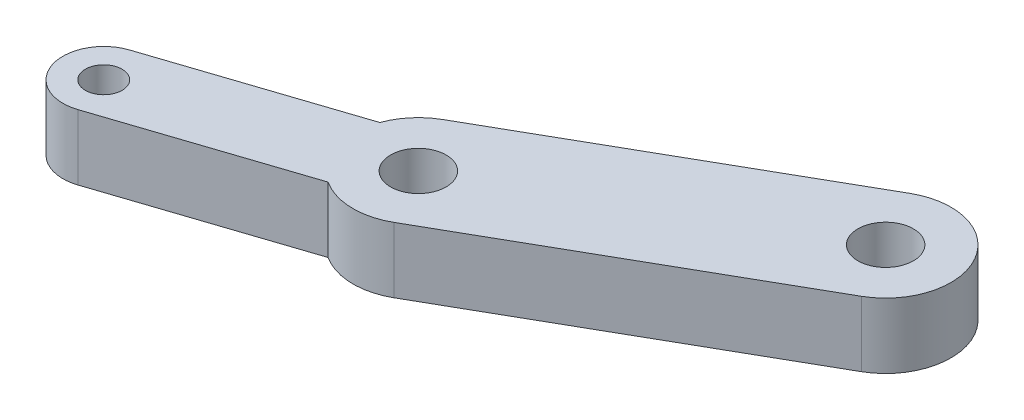
ISO-10303-21;
HEADER;
FILE_DESCRIPTION(('STEP AP214'),'2;1');
FILE_NAME('part.step','',(''),(''),'','','');
FILE_SCHEMA(('AUTOMOTIVE_DESIGN { 1 0 10303 214 1 1 1 1 }'));
ENDSEC;
DATA;
#1=APPLICATION_CONTEXT('core data for automotive mechanical design processes');
#2=APPLICATION_PROTOCOL_DEFINITION('international standard','automotive_design',2000,#1);
#3=PRODUCT_CONTEXT('',#1,'mechanical');
#4=PRODUCT('Part','Part','',(#3));
#5=PRODUCT_RELATED_PRODUCT_CATEGORY('part','',(#4));
#6=PRODUCT_DEFINITION_FORMATION('','',#4);
#7=PRODUCT_DEFINITION_CONTEXT('part definition',#1,'design');
#8=PRODUCT_DEFINITION('design','',#6,#7);
#9=PRODUCT_DEFINITION_SHAPE('','',#8);
#10=(LENGTH_UNIT() NAMED_UNIT(*) SI_UNIT(.MILLI.,.METRE.));
#11=(NAMED_UNIT(*) PLANE_ANGLE_UNIT() SI_UNIT($,.RADIAN.));
#12=(NAMED_UNIT(*) SI_UNIT($,.STERADIAN.) SOLID_ANGLE_UNIT());
#13=UNCERTAINTY_MEASURE_WITH_UNIT(LENGTH_MEASURE(1.E-05),#10,'distance_accuracy_value','');
#14=(GEOMETRIC_REPRESENTATION_CONTEXT(3) GLOBAL_UNCERTAINTY_ASSIGNED_CONTEXT((#13)) GLOBAL_UNIT_ASSIGNED_CONTEXT((#10,
#11,#12)) REPRESENTATION_CONTEXT('',''));
#15=CARTESIAN_POINT('',(0.,0.,0.));
#16=DIRECTION('',(0.,0.,1.));
#17=DIRECTION('',(1.,0.,0.));
#18=AXIS2_PLACEMENT_3D('',#15,#16,#17);
#19=CARTESIAN_POINT('',(1.36143187754203,4.,-8.38341801603753));
#20=DIRECTION('',(0.,1.,0.));
#21=DIRECTION('',(0.,0.,1.));
#22=AXIS2_PLACEMENT_3D('',#19,#20,#21);
#23=PLANE('',#22);
#24=CARTESIAN_POINT('',(1.36143187754203,4.,-8.38341801603753));
#25=DIRECTION('',(0.,1.,0.));
#26=DIRECTION('',(0.,0.,1.));
#27=AXIS2_PLACEMENT_3D('',#24,#25,#26);
#28=CIRCLE('',#27,1.125);
#29=CARTESIAN_POINT('',(1.36143187754203,4.,-7.25841801603753));
#30=VERTEX_POINT('',#29);
#31=EDGE_CURVE('E182',#30,#30,#28,.T.);
#32=ORIENTED_EDGE('',*,*,#31,.F.);
#33=EDGE_LOOP('',(#32));
#34=FACE_BOUND('',#33,.T.);
#35=CARTESIAN_POINT('',(1.36143187754203,4.,-8.38341801603753));
#36=DIRECTION('',(0.,1.,0.));
#37=DIRECTION('',(0.,0.,1.));
#38=AXIS2_PLACEMENT_3D('',#35,#36,#37);
#39=CIRCLE('',#38,2.5);
#40=CARTESIAN_POINT('',(0.574387414911864,4.,-10.7562983362061));
#41=VERTEX_POINT('',#40);
#42=CARTESIAN_POINT('',(2.14847634017219,4.,-6.01053769586898));
#43=VERTEX_POINT('',#42);
#44=EDGE_CURVE('E145',#41,#43,#39,.T.);
#45=ORIENTED_EDGE('',*,*,#44,.T.);
#46=DIRECTION('',(0.94915212806742,0.,-0.314817785052065));
#47=VECTOR('',#46,1.);
#48=CARTESIAN_POINT('',(2.14847634017219,4.,-6.01053769586898));
#49=LINE('',#48,#47);
#50=CARTESIAN_POINT('',(13.6540342616276,4.,-9.82673760051012));
#51=VERTEX_POINT('',#50);
#52=EDGE_CURVE('E93',#43,#51,#49,.T.);
#53=ORIENTED_EDGE('',*,*,#52,.T.);
#54=CARTESIAN_POINT('',(15.8307163689757,4.,-13.1826361394339));
#55=DIRECTION('',(0.,1.,0.));
#56=DIRECTION('',(0.,0.,1.));
#57=AXIS2_PLACEMENT_3D('',#54,#55,#56);
#58=CIRCLE('',#57,4.);
#59=CARTESIAN_POINT('',(17.8117611820872,4.,-9.70765967211149));
#60=VERTEX_POINT('',#59);
#61=EDGE_CURVE('E160',#51,#60,#58,.T.);
#62=ORIENTED_EDGE('',*,*,#61,.T.);
#63=DIRECTION('',(0.868744116830589,0.,-0.495261203277866));
#64=VECTOR('',#63,1.);
#65=CARTESIAN_POINT('',(17.8117611820872,4.,-9.70765967211149));
#66=LINE('',#65,#64);
#67=CARTESIAN_POINT('',(36.037808103394,4.,-20.0981230483435));
#68=VERTEX_POINT('',#67);
#69=EDGE_CURVE('E173',#60,#68,#66,.T.);
#70=ORIENTED_EDGE('',*,*,#69,.T.);
#71=CARTESIAN_POINT('',(34.0567632902825,4.,-23.5730995156659));
#72=DIRECTION('',(0.,1.,0.));
#73=DIRECTION('',(0.,0.,1.));
#74=AXIS2_PLACEMENT_3D('',#71,#72,#73);
#75=CIRCLE('',#74,4.);
#76=CARTESIAN_POINT('',(32.0757184771711,4.,-27.0480759829882));
#77=VERTEX_POINT('',#76);
#78=EDGE_CURVE('E112',#68,#77,#75,.T.);
#79=ORIENTED_EDGE('',*,*,#78,.T.);
#80=DIRECTION('',(-0.868744116830589,0.,0.495261203277866));
#81=VECTOR('',#80,1.);
#82=CARTESIAN_POINT('',(13.8496715558643,4.,-16.6576126067562));
#83=LINE('',#82,#81);
#84=CARTESIAN_POINT('',(13.8496715558643,4.,-16.6576126067562));
#85=VERTEX_POINT('',#84);
#86=EDGE_CURVE('E106',#77,#85,#83,.T.);
#87=ORIENTED_EDGE('',*,*,#86,.T.);
#88=CARTESIAN_POINT('',(15.8307163689757,4.,-13.1826361394339));
#89=DIRECTION('',(0.,1.,0.));
#90=DIRECTION('',(0.,0.,1.));
#91=AXIS2_PLACEMENT_3D('',#88,#89,#90);
#92=CIRCLE('',#91,4.);
#93=CARTESIAN_POINT('',(12.0799453363672,4.,-14.5724982408472));
#94=VERTEX_POINT('',#93);
#95=EDGE_CURVE('E110',#85,#94,#92,.T.);
#96=ORIENTED_EDGE('',*,*,#95,.T.);
#97=DIRECTION('',(-0.94915212806742,0.,0.314817785052065));
#98=VECTOR('',#97,1.);
#99=CARTESIAN_POINT('',(0.574387414911864,4.,-10.7562983362061));
#100=LINE('',#99,#98);
#101=EDGE_CURVE('E50',#94,#41,#100,.T.);
#102=ORIENTED_EDGE('',*,*,#101,.T.);
#103=EDGE_LOOP('',(#45,#53,#62,#70,#79,#87,#96,#102));
#104=FACE_BOUND('',#103,.T.);
#105=CARTESIAN_POINT('',(15.8307163689757,4.,-13.1826361394339));
#106=DIRECTION('',(0.,1.,0.));
#107=DIRECTION('',(0.,0.,1.));
#108=AXIS2_PLACEMENT_3D('',#105,#106,#107);
#109=CIRCLE('',#108,1.7);
#110=CARTESIAN_POINT('',(15.8307163689757,4.,-11.4826361394339));
#111=VERTEX_POINT('',#110);
#112=EDGE_CURVE('E134',#111,#111,#109,.T.);
#113=ORIENTED_EDGE('',*,*,#112,.F.);
#114=EDGE_LOOP('',(#113));
#115=FACE_BOUND('',#114,.T.);
#116=CARTESIAN_POINT('',(34.0567632902825,4.,-23.5730995156659));
#117=DIRECTION('',(0.,1.,0.));
#118=DIRECTION('',(0.,0.,1.));
#119=AXIS2_PLACEMENT_3D('',#116,#117,#118);
#120=CIRCLE('',#119,1.7);
#121=CARTESIAN_POINT('',(34.0567632902825,4.,-21.8730995156659));
#122=VERTEX_POINT('',#121);
#123=EDGE_CURVE('E188',#122,#122,#120,.T.);
#124=ORIENTED_EDGE('',*,*,#123,.F.);
#125=EDGE_LOOP('',(#124));
#126=FACE_BOUND('',#125,.T.);
#127=ADVANCED_FACE('F33',(#34,#104,#115,#126),#23,.T.);
#128=CARTESIAN_POINT('',(1.36143187754203,0.,-8.38341801603753));
#129=DIRECTION('',(0.,1.,0.));
#130=DIRECTION('',(0.,0.,1.));
#131=AXIS2_PLACEMENT_3D('',#128,#129,#130);
#132=PLANE('',#131);
#133=CARTESIAN_POINT('',(1.36143187754203,0.,-8.38341801603753));
#134=DIRECTION('',(0.,1.,0.));
#135=DIRECTION('',(0.,0.,1.));
#136=AXIS2_PLACEMENT_3D('',#133,#134,#135);
#137=CIRCLE('',#136,2.5);
#138=CARTESIAN_POINT('',(0.574387414911864,0.,-10.7562983362061));
#139=VERTEX_POINT('',#138);
#140=CARTESIAN_POINT('',(2.14847634017219,0.,-6.01053769586898));
#141=VERTEX_POINT('',#140);
#142=EDGE_CURVE('E130',#139,#141,#137,.T.);
#143=ORIENTED_EDGE('',*,*,#142,.F.);
#144=DIRECTION('',(-0.94915212806742,0.,0.314817785052065));
#145=VECTOR('',#144,1.);
#146=CARTESIAN_POINT('',(0.574387414911864,0.,-10.7562983362061));
#147=LINE('',#146,#145);
#148=CARTESIAN_POINT('',(12.0799453363672,0.,-14.5724982408472));
#149=VERTEX_POINT('',#148);
#150=EDGE_CURVE('E85',#149,#139,#147,.T.);
#151=ORIENTED_EDGE('',*,*,#150,.F.);
#152=CARTESIAN_POINT('',(15.8307163689757,0.,-13.1826361394339));
#153=DIRECTION('',(0.,1.,0.));
#154=DIRECTION('',(0.,0.,1.));
#155=AXIS2_PLACEMENT_3D('',#152,#153,#154);
#156=CIRCLE('',#155,4.);
#157=CARTESIAN_POINT('',(13.8496715558643,0.,-16.6576126067562));
#158=VERTEX_POINT('',#157);
#159=EDGE_CURVE('E79',#158,#149,#156,.T.);
#160=ORIENTED_EDGE('',*,*,#159,.F.);
#161=DIRECTION('',(-0.868744116830589,0.,0.495261203277866));
#162=VECTOR('',#161,1.);
#163=CARTESIAN_POINT('',(13.8496715558643,0.,-16.6576126067562));
#164=LINE('',#163,#162);
#165=CARTESIAN_POINT('',(32.0757184771711,0.,-27.0480759829882));
#166=VERTEX_POINT('',#165);
#167=EDGE_CURVE('E120',#166,#158,#164,.T.);
#168=ORIENTED_EDGE('',*,*,#167,.F.);
#169=CARTESIAN_POINT('',(34.0567632902825,0.,-23.5730995156659));
#170=DIRECTION('',(0.,1.,0.));
#171=DIRECTION('',(0.,0.,1.));
#172=AXIS2_PLACEMENT_3D('',#169,#170,#171);
#173=CIRCLE('',#172,4.);
#174=CARTESIAN_POINT('',(36.037808103394,0.,-20.0981230483435));
#175=VERTEX_POINT('',#174);
#176=EDGE_CURVE('E140',#175,#166,#173,.T.);
#177=ORIENTED_EDGE('',*,*,#176,.F.);
#178=DIRECTION('',(0.868744116830589,0.,-0.495261203277866));
#179=VECTOR('',#178,1.);
#180=CARTESIAN_POINT('',(17.8117611820872,0.,-9.70765967211149));
#181=LINE('',#180,#179);
#182=CARTESIAN_POINT('',(17.8117611820872,0.,-9.70765967211149));
#183=VERTEX_POINT('',#182);
#184=EDGE_CURVE('E138',#183,#175,#181,.T.);
#185=ORIENTED_EDGE('',*,*,#184,.F.);
#186=CARTESIAN_POINT('',(15.8307163689757,0.,-13.1826361394339));
#187=DIRECTION('',(0.,1.,0.));
#188=DIRECTION('',(0.,0.,1.));
#189=AXIS2_PLACEMENT_3D('',#186,#187,#188);
#190=CIRCLE('',#189,4.);
#191=CARTESIAN_POINT('',(13.6540342616276,0.,-9.82673760051012));
#192=VERTEX_POINT('',#191);
#193=EDGE_CURVE('E136',#192,#183,#190,.T.);
#194=ORIENTED_EDGE('',*,*,#193,.F.);
#195=DIRECTION('',(0.94915212806742,0.,-0.314817785052065));
#196=VECTOR('',#195,1.);
#197=CARTESIAN_POINT('',(2.14847634017219,0.,-6.01053769586898));
#198=LINE('',#197,#196);
#199=EDGE_CURVE('E133',#141,#192,#198,.T.);
#200=ORIENTED_EDGE('',*,*,#199,.F.);
#201=EDGE_LOOP('',(#143,#151,#160,#168,#177,#185,#194,#200));
#202=FACE_BOUND('',#201,.T.);
#203=CARTESIAN_POINT('',(15.8307163689757,0.,-13.1826361394339));
#204=DIRECTION('',(0.,1.,0.));
#205=DIRECTION('',(0.,0.,1.));
#206=AXIS2_PLACEMENT_3D('',#203,#204,#205);
#207=CIRCLE('',#206,1.7);
#208=CARTESIAN_POINT('',(15.8307163689757,0.,-11.4826361394339));
#209=VERTEX_POINT('',#208);
#210=EDGE_CURVE('E179',#209,#209,#207,.T.);
#211=ORIENTED_EDGE('',*,*,#210,.T.);
#212=EDGE_LOOP('',(#211));
#213=FACE_BOUND('',#212,.T.);
#214=CARTESIAN_POINT('',(1.36143187754203,0.,-8.38341801603753));
#215=DIRECTION('',(0.,1.,0.));
#216=DIRECTION('',(0.,0.,1.));
#217=AXIS2_PLACEMENT_3D('',#214,#215,#216);
#218=CIRCLE('',#217,1.125);
#219=CARTESIAN_POINT('',(1.36143187754203,0.,-7.25841801603753));
#220=VERTEX_POINT('',#219);
#221=EDGE_CURVE('E185',#220,#220,#218,.T.);
#222=ORIENTED_EDGE('',*,*,#221,.T.);
#223=EDGE_LOOP('',(#222));
#224=FACE_BOUND('',#223,.T.);
#225=CARTESIAN_POINT('',(34.0567632902825,0.,-23.5730995156659));
#226=DIRECTION('',(0.,1.,0.));
#227=DIRECTION('',(0.,0.,1.));
#228=AXIS2_PLACEMENT_3D('',#225,#226,#227);
#229=CIRCLE('',#228,1.7);
#230=CARTESIAN_POINT('',(34.0567632902825,0.,-21.8730995156659));
#231=VERTEX_POINT('',#230);
#232=EDGE_CURVE('E191',#231,#231,#229,.T.);
#233=ORIENTED_EDGE('',*,*,#232,.T.);
#234=EDGE_LOOP('',(#233));
#235=FACE_BOUND('',#234,.T.);
#236=ADVANCED_FACE('F164',(#202,#213,#224,#235),#132,.F.);
#237=CARTESIAN_POINT('',(1.36143187754203,4.,-8.38341801603753));
#238=DIRECTION('',(0.,-1.,0.));
#239=DIRECTION('',(0.,0.,-1.));
#240=AXIS2_PLACEMENT_3D('',#237,#238,#239);
#241=CYLINDRICAL_SURFACE('',#240,2.5);
#242=ORIENTED_EDGE('',*,*,#142,.T.);
#243=DIRECTION('',(0.,-1.,0.));
#244=VECTOR('',#243,1.);
#245=CARTESIAN_POINT('',(2.14847634017219,4.,-6.01053769586898));
#246=LINE('',#245,#244);
#247=EDGE_CURVE('E11',#43,#141,#246,.T.);
#248=ORIENTED_EDGE('',*,*,#247,.F.);
#249=ORIENTED_EDGE('',*,*,#44,.F.);
#250=DIRECTION('',(0.,-1.,0.));
#251=VECTOR('',#250,1.);
#252=CARTESIAN_POINT('',(0.574387414911864,4.,-10.7562983362061));
#253=LINE('',#252,#251);
#254=EDGE_CURVE('E126',#41,#139,#253,.T.);
#255=ORIENTED_EDGE('',*,*,#254,.T.);
#256=EDGE_LOOP('',(#242,#248,#249,#255));
#257=FACE_BOUND('',#256,.T.);
#258=ADVANCED_FACE('F35',(#257),#241,.T.);
#259=CARTESIAN_POINT('',(2.14847634017219,4.,-6.01053769586898));
#260=DIRECTION('',(-0.314817785052065,0.,-0.94915212806742));
#261=DIRECTION('',(-0.94915212806742,0.,0.314817785052065));
#262=AXIS2_PLACEMENT_3D('',#259,#260,#261);
#263=PLANE('',#262);
#264=ORIENTED_EDGE('',*,*,#199,.T.);
#265=DIRECTION('',(0.,-1.,0.));
#266=VECTOR('',#265,1.);
#267=CARTESIAN_POINT('',(13.6540342616276,4.,-9.82673760051012));
#268=LINE('',#267,#266);
#269=EDGE_CURVE('E42',#51,#192,#268,.T.);
#270=ORIENTED_EDGE('',*,*,#269,.F.);
#271=ORIENTED_EDGE('',*,*,#52,.F.);
#272=ORIENTED_EDGE('',*,*,#247,.T.);
#273=EDGE_LOOP('',(#264,#270,#271,#272));
#274=FACE_BOUND('',#273,.T.);
#275=ADVANCED_FACE('F224',(#274),#263,.F.);
#276=CARTESIAN_POINT('',(15.8307163689757,4.,-13.1826361394339));
#277=DIRECTION('',(0.,-1.,0.));
#278=DIRECTION('',(0.,0.,-1.));
#279=AXIS2_PLACEMENT_3D('',#276,#277,#278);
#280=CYLINDRICAL_SURFACE('',#279,4.);
#281=ORIENTED_EDGE('',*,*,#193,.T.);
#282=DIRECTION('',(0.,-1.,0.));
#283=VECTOR('',#282,1.);
#284=CARTESIAN_POINT('',(17.8117611820872,4.,-9.70765967211149));
#285=LINE('',#284,#283);
#286=EDGE_CURVE('E152',#60,#183,#285,.T.);
#287=ORIENTED_EDGE('',*,*,#286,.F.);
#288=ORIENTED_EDGE('',*,*,#61,.F.);
#289=ORIENTED_EDGE('',*,*,#269,.T.);
#290=EDGE_LOOP('',(#281,#287,#288,#289));
#291=FACE_BOUND('',#290,.T.);
#292=ADVANCED_FACE('F158',(#291),#280,.T.);
#293=CARTESIAN_POINT('',(17.8117611820872,4.,-9.70765967211149));
#294=DIRECTION('',(-0.495261203277867,0.,-0.868744116830589));
#295=DIRECTION('',(-0.868744116830589,0.,0.495261203277867));
#296=AXIS2_PLACEMENT_3D('',#293,#294,#295);
#297=PLANE('',#296);
#298=ORIENTED_EDGE('',*,*,#184,.T.);
#299=DIRECTION('',(0.,-1.,0.));
#300=VECTOR('',#299,1.);
#301=CARTESIAN_POINT('',(36.037808103394,4.,-20.0981230483435));
#302=LINE('',#301,#300);
#303=EDGE_CURVE('E149',#68,#175,#302,.T.);
#304=ORIENTED_EDGE('',*,*,#303,.F.);
#305=ORIENTED_EDGE('',*,*,#69,.F.);
#306=ORIENTED_EDGE('',*,*,#286,.T.);
#307=EDGE_LOOP('',(#298,#304,#305,#306));
#308=FACE_BOUND('',#307,.T.);
#309=ADVANCED_FACE('F169',(#308),#297,.F.);
#310=CARTESIAN_POINT('',(34.0567632902825,4.,-23.5730995156659));
#311=DIRECTION('',(0.,-1.,0.));
#312=DIRECTION('',(0.,0.,-1.));
#313=AXIS2_PLACEMENT_3D('',#310,#311,#312);
#314=CYLINDRICAL_SURFACE('',#313,4.);
#315=ORIENTED_EDGE('',*,*,#176,.T.);
#316=DIRECTION('',(0.,-1.,0.));
#317=VECTOR('',#316,1.);
#318=CARTESIAN_POINT('',(32.0757184771711,4.,-27.0480759829882));
#319=LINE('',#318,#317);
#320=EDGE_CURVE('E121',#77,#166,#319,.T.);
#321=ORIENTED_EDGE('',*,*,#320,.F.);
#322=ORIENTED_EDGE('',*,*,#78,.F.);
#323=ORIENTED_EDGE('',*,*,#303,.T.);
#324=EDGE_LOOP('',(#315,#321,#322,#323));
#325=FACE_BOUND('',#324,.T.);
#326=ADVANCED_FACE('F172',(#325),#314,.T.);
#327=CARTESIAN_POINT('',(13.8496715558643,4.,-16.6576126067562));
#328=DIRECTION('',(0.495261203277866,0.,0.868744116830589));
#329=DIRECTION('',(0.868744116830589,0.,-0.495261203277866));
#330=AXIS2_PLACEMENT_3D('',#327,#328,#329);
#331=PLANE('',#330);
#332=ORIENTED_EDGE('',*,*,#167,.T.);
#333=DIRECTION('',(0.,-1.,0.));
#334=VECTOR('',#333,1.);
#335=CARTESIAN_POINT('',(13.8496715558643,4.,-16.6576126067562));
#336=LINE('',#335,#334);
#337=EDGE_CURVE('E117',#85,#158,#336,.T.);
#338=ORIENTED_EDGE('',*,*,#337,.F.);
#339=ORIENTED_EDGE('',*,*,#86,.F.);
#340=ORIENTED_EDGE('',*,*,#320,.T.);
#341=EDGE_LOOP('',(#332,#338,#339,#340));
#342=FACE_BOUND('',#341,.T.);
#343=ADVANCED_FACE('F118',(#342),#331,.F.);
#344=CARTESIAN_POINT('',(15.8307163689757,4.,-13.1826361394339));
#345=DIRECTION('',(0.,-1.,0.));
#346=DIRECTION('',(0.,0.,-1.));
#347=AXIS2_PLACEMENT_3D('',#344,#345,#346);
#348=CYLINDRICAL_SURFACE('',#347,4.);
#349=ORIENTED_EDGE('',*,*,#159,.T.);
#350=DIRECTION('',(0.,-1.,0.));
#351=VECTOR('',#350,1.);
#352=CARTESIAN_POINT('',(12.0799453363672,4.,-14.5724982408472));
#353=LINE('',#352,#351);
#354=EDGE_CURVE('E122',#94,#149,#353,.T.);
#355=ORIENTED_EDGE('',*,*,#354,.F.);
#356=ORIENTED_EDGE('',*,*,#95,.F.);
#357=ORIENTED_EDGE('',*,*,#337,.T.);
#358=EDGE_LOOP('',(#349,#355,#356,#357));
#359=FACE_BOUND('',#358,.T.);
#360=ADVANCED_FACE('F124',(#359),#348,.T.);
#361=CARTESIAN_POINT('',(0.574387414911864,4.,-10.7562983362061));
#362=DIRECTION('',(0.314817785052065,0.,0.94915212806742));
#363=DIRECTION('',(0.94915212806742,0.,-0.314817785052065));
#364=AXIS2_PLACEMENT_3D('',#361,#362,#363);
#365=PLANE('',#364);
#366=ORIENTED_EDGE('',*,*,#150,.T.);
#367=ORIENTED_EDGE('',*,*,#254,.F.);
#368=ORIENTED_EDGE('',*,*,#101,.F.);
#369=ORIENTED_EDGE('',*,*,#354,.T.);
#370=EDGE_LOOP('',(#366,#367,#368,#369));
#371=FACE_BOUND('',#370,.T.);
#372=ADVANCED_FACE('F212',(#371),#365,.F.);
#373=CARTESIAN_POINT('',(15.8307163689757,4.,-13.1826361394339));
#374=DIRECTION('',(0.,-1.,0.));
#375=DIRECTION('',(0.,0.,-1.));
#376=AXIS2_PLACEMENT_3D('',#373,#374,#375);
#377=CYLINDRICAL_SURFACE('',#376,1.7);
#378=ORIENTED_EDGE('',*,*,#112,.T.);
#379=EDGE_LOOP('',(#378));
#380=FACE_BOUND('',#379,.T.);
#381=ORIENTED_EDGE('',*,*,#210,.F.);
#382=EDGE_LOOP('',(#381));
#383=FACE_BOUND('',#382,.T.);
#384=ADVANCED_FACE('F209',(#380,#383),#377,.F.);
#385=CARTESIAN_POINT('',(1.36143187754203,4.,-8.38341801603753));
#386=DIRECTION('',(0.,-1.,0.));
#387=DIRECTION('',(0.,0.,-1.));
#388=AXIS2_PLACEMENT_3D('',#385,#386,#387);
#389=CYLINDRICAL_SURFACE('',#388,1.125);
#390=ORIENTED_EDGE('',*,*,#31,.T.);
#391=EDGE_LOOP('',(#390));
#392=FACE_BOUND('',#391,.T.);
#393=ORIENTED_EDGE('',*,*,#221,.F.);
#394=EDGE_LOOP('',(#393));
#395=FACE_BOUND('',#394,.T.);
#396=ADVANCED_FACE('F288',(#392,#395),#389,.F.);
#397=CARTESIAN_POINT('',(34.0567632902825,4.,-23.5730995156659));
#398=DIRECTION('',(0.,-1.,0.));
#399=DIRECTION('',(0.,0.,-1.));
#400=AXIS2_PLACEMENT_3D('',#397,#398,#399);
#401=CYLINDRICAL_SURFACE('',#400,1.7);
#402=ORIENTED_EDGE('',*,*,#123,.T.);
#403=EDGE_LOOP('',(#402));
#404=FACE_BOUND('',#403,.T.);
#405=ORIENTED_EDGE('',*,*,#232,.F.);
#406=EDGE_LOOP('',(#405));
#407=FACE_BOUND('',#406,.T.);
#408=ADVANCED_FACE('F197',(#404,#407),#401,.F.);
#409=CLOSED_SHELL('',(#127,#236,#258,#275,#292,#309,#326,#343,#360,#372,#384,#396,#408));
#410=MANIFOLD_SOLID_BREP('B2',#409);
#411=ADVANCED_BREP_SHAPE_REPRESENTATION('',(#18,#410),#14);
#412=SHAPE_DEFINITION_REPRESENTATION(#9,#411);
ENDSEC;
END-ISO-10303-21;
